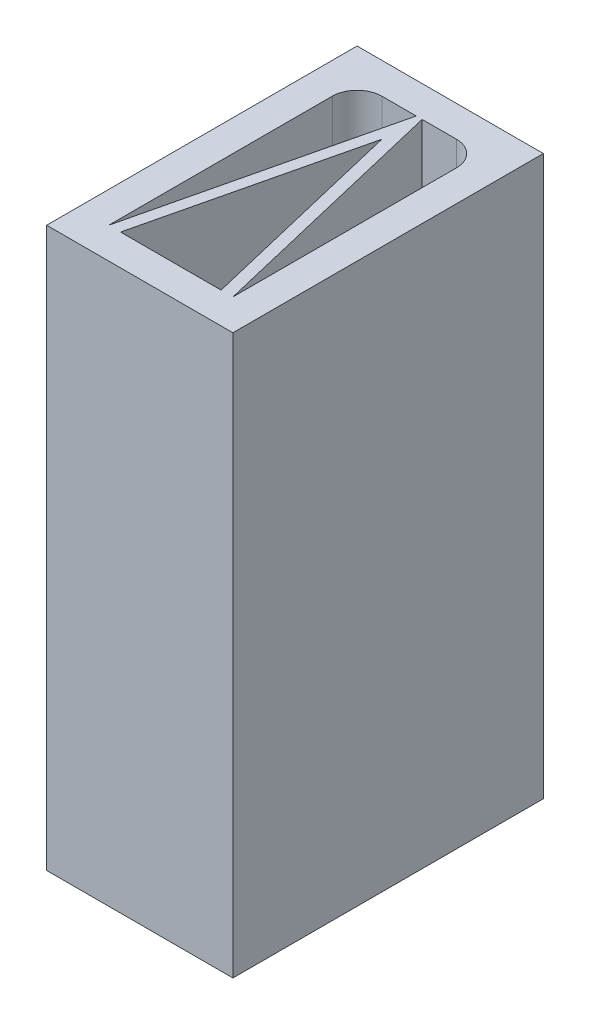
ISO-10303-21;
HEADER;
FILE_DESCRIPTION(('STEP AP214'),'2;1');
FILE_NAME('part.step','',(''),(''),'','','');
FILE_SCHEMA(('AUTOMOTIVE_DESIGN { 1 0 10303 214 1 1 1 1 }'));
ENDSEC;
DATA;
#1=APPLICATION_CONTEXT('core data for automotive mechanical design processes');
#2=APPLICATION_PROTOCOL_DEFINITION('international standard','automotive_design',2000,#1);
#3=PRODUCT_CONTEXT('',#1,'mechanical');
#4=PRODUCT('Part','Part','',(#3));
#5=PRODUCT_RELATED_PRODUCT_CATEGORY('part','',(#4));
#6=PRODUCT_DEFINITION_FORMATION('','',#4);
#7=PRODUCT_DEFINITION_CONTEXT('part definition',#1,'design');
#8=PRODUCT_DEFINITION('design','',#6,#7);
#9=PRODUCT_DEFINITION_SHAPE('','',#8);
#10=(LENGTH_UNIT() NAMED_UNIT(*) SI_UNIT(.MILLI.,.METRE.));
#11=(NAMED_UNIT(*) PLANE_ANGLE_UNIT() SI_UNIT($,.RADIAN.));
#12=(NAMED_UNIT(*) SI_UNIT($,.STERADIAN.) SOLID_ANGLE_UNIT());
#13=UNCERTAINTY_MEASURE_WITH_UNIT(LENGTH_MEASURE(1.E-05),#10,'distance_accuracy_value','');
#14=(GEOMETRIC_REPRESENTATION_CONTEXT(3) GLOBAL_UNCERTAINTY_ASSIGNED_CONTEXT((#13)) GLOBAL_UNIT_ASSIGNED_CONTEXT((#10,
#11,#12)) REPRESENTATION_CONTEXT('',''));
#15=CARTESIAN_POINT('',(0.,0.,0.));
#16=DIRECTION('',(0.,0.,1.));
#17=DIRECTION('',(1.,0.,0.));
#18=AXIS2_PLACEMENT_3D('',#15,#16,#17);
#19=CARTESIAN_POINT('',(2.5,45.,-22.5));
#20=DIRECTION('',(0.,0.,1.));
#21=DIRECTION('',(1.,0.,0.));
#22=AXIS2_PLACEMENT_3D('',#19,#20,#21);
#23=PLANE('',#22);
#24=DIRECTION('',(-1.,0.,0.));
#25=VECTOR('',#24,1.);
#26=CARTESIAN_POINT('',(2.5,0.,-22.5));
#27=LINE('',#26,#25);
#28=CARTESIAN_POINT('',(10.5,0.,-22.5));
#29=VERTEX_POINT('',#28);
#30=CARTESIAN_POINT('',(7.73809523809524,0.,-22.5));
#31=VERTEX_POINT('',#30);
#32=EDGE_CURVE('E186',#29,#31,#27,.T.);
#33=ORIENTED_EDGE('',*,*,#32,.F.);
#34=DIRECTION('',(0.,-1.,0.));
#35=VECTOR('',#34,1.);
#36=CARTESIAN_POINT('',(10.5,45.,-22.5));
#37=LINE('',#36,#35);
#38=CARTESIAN_POINT('',(10.5,45.,-22.5));
#39=VERTEX_POINT('',#38);
#40=EDGE_CURVE('E53',#29,#39,#37,.F.);
#41=ORIENTED_EDGE('',*,*,#40,.T.);
#42=DIRECTION('',(-1.,0.,0.));
#43=VECTOR('',#42,1.);
#44=CARTESIAN_POINT('',(2.5,45.,-22.5));
#45=LINE('',#44,#43);
#46=CARTESIAN_POINT('',(7.73809523809524,45.,-22.5));
#47=VERTEX_POINT('',#46);
#48=EDGE_CURVE('E192',#39,#47,#45,.T.);
#49=ORIENTED_EDGE('',*,*,#48,.T.);
#50=DIRECTION('',(0.,1.,0.));
#51=VECTOR('',#50,1.);
#52=CARTESIAN_POINT('',(7.73809523809524,45.,-22.5));
#53=LINE('',#52,#51);
#54=EDGE_CURVE('E241',#31,#47,#53,.T.);
#55=ORIENTED_EDGE('',*,*,#54,.F.);
#56=EDGE_LOOP('',(#33,#41,#49,#55));
#57=FACE_BOUND('',#56,.T.);
#58=ADVANCED_FACE('F38',(#57),#23,.T.);
#59=CARTESIAN_POINT('',(0.,45.,0.));
#60=DIRECTION('',(0.,-1.,0.));
#61=DIRECTION('',(0.,0.,-1.));
#62=AXIS2_PLACEMENT_3D('',#59,#60,#61);
#63=PLANE('',#62);
#64=DIRECTION('',(0.23162052730604,0.,0.972806214685367));
#65=VECTOR('',#64,1.);
#66=CARTESIAN_POINT('',(12.5,45.,-2.5));
#67=LINE('',#66,#65);
#68=CARTESIAN_POINT('',(12.5,45.,-2.5));
#69=VERTEX_POINT('',#68);
#70=EDGE_CURVE('E174',#47,#69,#67,.T.);
#71=ORIENTED_EDGE('',*,*,#70,.F.);
#72=ORIENTED_EDGE('',*,*,#48,.F.);
#73=CARTESIAN_POINT('',(10.5,45.,-20.5));
#74=DIRECTION('',(0.,-1.,0.));
#75=DIRECTION('',(0.,0.,-1.));
#76=AXIS2_PLACEMENT_3D('',#73,#74,#75);
#77=CIRCLE('',#76,2.);
#78=CARTESIAN_POINT('',(12.5,45.,-20.5));
#79=VERTEX_POINT('',#78);
#80=EDGE_CURVE('E11',#39,#79,#77,.T.);
#81=ORIENTED_EDGE('',*,*,#80,.T.);
#82=DIRECTION('',(0.,0.,-1.));
#83=VECTOR('',#82,1.);
#84=CARTESIAN_POINT('',(12.5,45.,-22.5));
#85=LINE('',#84,#83);
#86=EDGE_CURVE('E188',#69,#79,#85,.T.);
#87=ORIENTED_EDGE('',*,*,#86,.F.);
#88=EDGE_LOOP('',(#71,#72,#81,#87));
#89=FACE_BOUND('',#88,.T.);
#90=DIRECTION('',(-0.231620527306039,0.,-0.972806214685367));
#91=VECTOR('',#90,1.);
#92=CARTESIAN_POINT('',(11.547619047619,45.,-2.5));
#93=LINE('',#92,#91);
#94=CARTESIAN_POINT('',(11.547619047619,45.,-2.5));
#95=VERTEX_POINT('',#94);
#96=CARTESIAN_POINT('',(7.5,45.,-19.5));
#97=VERTEX_POINT('',#96);
#98=EDGE_CURVE('E161',#95,#97,#93,.T.);
#99=ORIENTED_EDGE('',*,*,#98,.F.);
#100=DIRECTION('',(1.,0.,0.));
#101=VECTOR('',#100,1.);
#102=CARTESIAN_POINT('',(2.5,45.,-2.5));
#103=LINE('',#102,#101);
#104=CARTESIAN_POINT('',(3.45238095238096,45.,-2.5));
#105=VERTEX_POINT('',#104);
#106=EDGE_CURVE('E162',#105,#95,#103,.T.);
#107=ORIENTED_EDGE('',*,*,#106,.F.);
#108=DIRECTION('',(-0.231620527306039,0.,0.972806214685367));
#109=VECTOR('',#108,1.);
#110=CARTESIAN_POINT('',(7.5,45.,-19.5));
#111=LINE('',#110,#109);
#112=EDGE_CURVE('E146',#97,#105,#111,.T.);
#113=ORIENTED_EDGE('',*,*,#112,.F.);
#114=EDGE_LOOP('',(#99,#107,#113));
#115=FACE_BOUND('',#114,.T.);
#116=DIRECTION('',(0.,0.,1.));
#117=VECTOR('',#116,1.);
#118=CARTESIAN_POINT('',(0.,45.,0.));
#119=LINE('',#118,#117);
#120=CARTESIAN_POINT('',(0.,45.,-25.));
#121=VERTEX_POINT('',#120);
#122=CARTESIAN_POINT('',(0.,45.,0.));
#123=VERTEX_POINT('',#122);
#124=EDGE_CURVE('E209',#121,#123,#119,.T.);
#125=ORIENTED_EDGE('',*,*,#124,.T.);
#126=DIRECTION('',(1.,0.,0.));
#127=VECTOR('',#126,1.);
#128=CARTESIAN_POINT('',(0.,45.,0.));
#129=LINE('',#128,#127);
#130=CARTESIAN_POINT('',(15.,45.,0.));
#131=VERTEX_POINT('',#130);
#132=EDGE_CURVE('E212',#123,#131,#129,.T.);
#133=ORIENTED_EDGE('',*,*,#132,.T.);
#134=DIRECTION('',(0.,0.,-1.));
#135=VECTOR('',#134,1.);
#136=CARTESIAN_POINT('',(15.,45.,0.));
#137=LINE('',#136,#135);
#138=CARTESIAN_POINT('',(15.,45.,-25.));
#139=VERTEX_POINT('',#138);
#140=EDGE_CURVE('E215',#131,#139,#137,.T.);
#141=ORIENTED_EDGE('',*,*,#140,.T.);
#142=DIRECTION('',(-1.,0.,0.));
#143=VECTOR('',#142,1.);
#144=CARTESIAN_POINT('',(0.,45.,-25.));
#145=LINE('',#144,#143);
#146=EDGE_CURVE('E217',#139,#121,#145,.T.);
#147=ORIENTED_EDGE('',*,*,#146,.T.);
#148=EDGE_LOOP('',(#125,#133,#141,#147));
#149=FACE_BOUND('',#148,.T.);
#150=CARTESIAN_POINT('',(7.26190476190476,45.,-22.5));
#151=VERTEX_POINT('',#150);
#152=CARTESIAN_POINT('',(4.5,45.,-22.5));
#153=VERTEX_POINT('',#152);
#154=EDGE_CURVE('E191',#151,#153,#45,.T.);
#155=ORIENTED_EDGE('',*,*,#154,.F.);
#156=DIRECTION('',(0.23162052730604,0.,-0.972806214685367));
#157=VECTOR('',#156,1.);
#158=CARTESIAN_POINT('',(7.5,45.,-23.5));
#159=LINE('',#158,#157);
#160=CARTESIAN_POINT('',(2.5,45.,-2.5));
#161=VERTEX_POINT('',#160);
#162=EDGE_CURVE('E163',#161,#151,#159,.T.);
#163=ORIENTED_EDGE('',*,*,#162,.F.);
#164=DIRECTION('',(0.,0.,1.));
#165=VECTOR('',#164,1.);
#166=CARTESIAN_POINT('',(2.5,45.,-22.5));
#167=LINE('',#166,#165);
#168=CARTESIAN_POINT('',(2.5,45.,-20.5));
#169=VERTEX_POINT('',#168);
#170=EDGE_CURVE('E184',#169,#161,#167,.T.);
#171=ORIENTED_EDGE('',*,*,#170,.F.);
#172=CARTESIAN_POINT('',(4.5,45.,-20.5));
#173=DIRECTION('',(0.,-1.,0.));
#174=DIRECTION('',(0.,0.,-1.));
#175=AXIS2_PLACEMENT_3D('',#172,#173,#174);
#176=CIRCLE('',#175,2.);
#177=EDGE_CURVE('E255',#169,#153,#176,.T.);
#178=ORIENTED_EDGE('',*,*,#177,.T.);
#179=EDGE_LOOP('',(#155,#163,#171,#178));
#180=FACE_BOUND('',#179,.T.);
#181=ADVANCED_FACE('F159',(#89,#115,#149,#180),#63,.F.);
#182=CARTESIAN_POINT('',(0.,0.,0.));
#183=DIRECTION('',(0.,-1.,0.));
#184=DIRECTION('',(0.,0.,-1.));
#185=AXIS2_PLACEMENT_3D('',#182,#183,#184);
#186=PLANE('',#185);
#187=DIRECTION('',(0.,0.,-1.));
#188=VECTOR('',#187,1.);
#189=CARTESIAN_POINT('',(12.5,0.,-22.5));
#190=LINE('',#189,#188);
#191=CARTESIAN_POINT('',(12.5,0.,-2.5));
#192=VERTEX_POINT('',#191);
#193=CARTESIAN_POINT('',(12.5,0.,-20.5));
#194=VERTEX_POINT('',#193);
#195=EDGE_CURVE('E199',#192,#194,#190,.T.);
#196=ORIENTED_EDGE('',*,*,#195,.T.);
#197=CARTESIAN_POINT('',(10.5,0.,-20.5));
#198=DIRECTION('',(0.,-1.,0.));
#199=DIRECTION('',(0.,0.,-1.));
#200=AXIS2_PLACEMENT_3D('',#197,#198,#199);
#201=CIRCLE('',#200,2.);
#202=EDGE_CURVE('E46',#194,#29,#201,.F.);
#203=ORIENTED_EDGE('',*,*,#202,.T.);
#204=ORIENTED_EDGE('',*,*,#32,.T.);
#205=DIRECTION('',(0.23162052730604,0.,0.972806214685367));
#206=VECTOR('',#205,1.);
#207=CARTESIAN_POINT('',(12.5,0.,-2.5));
#208=LINE('',#207,#206);
#209=EDGE_CURVE('E167',#31,#192,#208,.T.);
#210=ORIENTED_EDGE('',*,*,#209,.T.);
#211=EDGE_LOOP('',(#196,#203,#204,#210));
#212=FACE_BOUND('',#211,.T.);
#213=DIRECTION('',(1.,0.,0.));
#214=VECTOR('',#213,1.);
#215=CARTESIAN_POINT('',(2.5,0.,-2.5));
#216=LINE('',#215,#214);
#217=CARTESIAN_POINT('',(3.45238095238096,0.,-2.5));
#218=VERTEX_POINT('',#217);
#219=CARTESIAN_POINT('',(11.547619047619,0.,-2.5));
#220=VERTEX_POINT('',#219);
#221=EDGE_CURVE('E196',#218,#220,#216,.T.);
#222=ORIENTED_EDGE('',*,*,#221,.T.);
#223=DIRECTION('',(-0.231620527306039,0.,-0.972806214685367));
#224=VECTOR('',#223,1.);
#225=CARTESIAN_POINT('',(11.547619047619,0.,-2.5));
#226=LINE('',#225,#224);
#227=CARTESIAN_POINT('',(7.5,0.,-19.5));
#228=VERTEX_POINT('',#227);
#229=EDGE_CURVE('E177',#220,#228,#226,.T.);
#230=ORIENTED_EDGE('',*,*,#229,.T.);
#231=DIRECTION('',(-0.231620527306039,0.,0.972806214685367));
#232=VECTOR('',#231,1.);
#233=CARTESIAN_POINT('',(7.5,0.,-19.5));
#234=LINE('',#233,#232);
#235=EDGE_CURVE('E148',#228,#218,#234,.T.);
#236=ORIENTED_EDGE('',*,*,#235,.T.);
#237=EDGE_LOOP('',(#222,#230,#236));
#238=FACE_BOUND('',#237,.T.);
#239=DIRECTION('',(0.23162052730604,0.,-0.972806214685367));
#240=VECTOR('',#239,1.);
#241=CARTESIAN_POINT('',(7.5,0.,-23.5));
#242=LINE('',#241,#240);
#243=CARTESIAN_POINT('',(2.5,0.,-2.5));
#244=VERTEX_POINT('',#243);
#245=CARTESIAN_POINT('',(7.26190476190476,0.,-22.5));
#246=VERTEX_POINT('',#245);
#247=EDGE_CURVE('E170',#244,#246,#242,.T.);
#248=ORIENTED_EDGE('',*,*,#247,.T.);
#249=CARTESIAN_POINT('',(4.5,0.,-22.5));
#250=VERTEX_POINT('',#249);
#251=EDGE_CURVE('E201',#246,#250,#27,.T.);
#252=ORIENTED_EDGE('',*,*,#251,.T.);
#253=CARTESIAN_POINT('',(4.5,0.,-20.5));
#254=DIRECTION('',(0.,-1.,0.));
#255=DIRECTION('',(0.,0.,-1.));
#256=AXIS2_PLACEMENT_3D('',#253,#254,#255);
#257=CIRCLE('',#256,2.);
#258=CARTESIAN_POINT('',(2.5,0.,-20.5));
#259=VERTEX_POINT('',#258);
#260=EDGE_CURVE('E253',#250,#259,#257,.F.);
#261=ORIENTED_EDGE('',*,*,#260,.T.);
#262=DIRECTION('',(0.,0.,1.));
#263=VECTOR('',#262,1.);
#264=CARTESIAN_POINT('',(2.5,0.,-22.5));
#265=LINE('',#264,#263);
#266=EDGE_CURVE('E181',#259,#244,#265,.T.);
#267=ORIENTED_EDGE('',*,*,#266,.T.);
#268=EDGE_LOOP('',(#248,#252,#261,#267));
#269=FACE_BOUND('',#268,.T.);
#270=DIRECTION('',(0.,0.,1.));
#271=VECTOR('',#270,1.);
#272=CARTESIAN_POINT('',(0.,0.,0.));
#273=LINE('',#272,#271);
#274=CARTESIAN_POINT('',(0.,0.,-25.));
#275=VERTEX_POINT('',#274);
#276=CARTESIAN_POINT('',(0.,0.,0.));
#277=VERTEX_POINT('',#276);
#278=EDGE_CURVE('E208',#275,#277,#273,.T.);
#279=ORIENTED_EDGE('',*,*,#278,.F.);
#280=DIRECTION('',(-1.,0.,0.));
#281=VECTOR('',#280,1.);
#282=CARTESIAN_POINT('',(0.,0.,-25.));
#283=LINE('',#282,#281);
#284=CARTESIAN_POINT('',(15.,0.,-25.));
#285=VERTEX_POINT('',#284);
#286=EDGE_CURVE('E213',#285,#275,#283,.T.);
#287=ORIENTED_EDGE('',*,*,#286,.F.);
#288=DIRECTION('',(0.,0.,-1.));
#289=VECTOR('',#288,1.);
#290=CARTESIAN_POINT('',(15.,0.,0.));
#291=LINE('',#290,#289);
#292=CARTESIAN_POINT('',(15.,0.,0.));
#293=VERTEX_POINT('',#292);
#294=EDGE_CURVE('E224',#293,#285,#291,.T.);
#295=ORIENTED_EDGE('',*,*,#294,.F.);
#296=DIRECTION('',(1.,0.,0.));
#297=VECTOR('',#296,1.);
#298=CARTESIAN_POINT('',(0.,0.,0.));
#299=LINE('',#298,#297);
#300=EDGE_CURVE('E222',#277,#293,#299,.T.);
#301=ORIENTED_EDGE('',*,*,#300,.F.);
#302=EDGE_LOOP('',(#279,#287,#295,#301));
#303=FACE_BOUND('',#302,.T.);
#304=ADVANCED_FACE('F273',(#212,#238,#269,#303),#186,.T.);
#305=CARTESIAN_POINT('',(0.,45.,0.));
#306=DIRECTION('',(1.,0.,0.));
#307=DIRECTION('',(0.,0.,-1.));
#308=AXIS2_PLACEMENT_3D('',#305,#306,#307);
#309=PLANE('',#308);
#310=ORIENTED_EDGE('',*,*,#278,.T.);
#311=DIRECTION('',(0.,-1.,0.));
#312=VECTOR('',#311,1.);
#313=CARTESIAN_POINT('',(0.,45.,0.));
#314=LINE('',#313,#312);
#315=EDGE_CURVE('E235',#123,#277,#314,.T.);
#316=ORIENTED_EDGE('',*,*,#315,.F.);
#317=ORIENTED_EDGE('',*,*,#124,.F.);
#318=DIRECTION('',(0.,-1.,0.));
#319=VECTOR('',#318,1.);
#320=CARTESIAN_POINT('',(0.,45.,-25.));
#321=LINE('',#320,#319);
#322=EDGE_CURVE('E219',#121,#275,#321,.T.);
#323=ORIENTED_EDGE('',*,*,#322,.T.);
#324=EDGE_LOOP('',(#310,#316,#317,#323));
#325=FACE_BOUND('',#324,.T.);
#326=ADVANCED_FACE('F318',(#325),#309,.F.);
#327=CARTESIAN_POINT('',(0.,45.,0.));
#328=DIRECTION('',(0.,0.,-1.));
#329=DIRECTION('',(-1.,0.,0.));
#330=AXIS2_PLACEMENT_3D('',#327,#328,#329);
#331=PLANE('',#330);
#332=ORIENTED_EDGE('',*,*,#300,.T.);
#333=DIRECTION('',(0.,-1.,0.));
#334=VECTOR('',#333,1.);
#335=CARTESIAN_POINT('',(15.,45.,0.));
#336=LINE('',#335,#334);
#337=EDGE_CURVE('E232',#131,#293,#336,.T.);
#338=ORIENTED_EDGE('',*,*,#337,.F.);
#339=ORIENTED_EDGE('',*,*,#132,.F.);
#340=ORIENTED_EDGE('',*,*,#315,.T.);
#341=EDGE_LOOP('',(#332,#338,#339,#340));
#342=FACE_BOUND('',#341,.T.);
#343=ADVANCED_FACE('F325',(#342),#331,.F.);
#344=CARTESIAN_POINT('',(15.,45.,0.));
#345=DIRECTION('',(-1.,0.,0.));
#346=DIRECTION('',(0.,0.,1.));
#347=AXIS2_PLACEMENT_3D('',#344,#345,#346);
#348=PLANE('',#347);
#349=ORIENTED_EDGE('',*,*,#294,.T.);
#350=DIRECTION('',(0.,-1.,0.));
#351=VECTOR('',#350,1.);
#352=CARTESIAN_POINT('',(15.,45.,-25.));
#353=LINE('',#352,#351);
#354=EDGE_CURVE('E229',#139,#285,#353,.T.);
#355=ORIENTED_EDGE('',*,*,#354,.F.);
#356=ORIENTED_EDGE('',*,*,#140,.F.);
#357=ORIENTED_EDGE('',*,*,#337,.T.);
#358=EDGE_LOOP('',(#349,#355,#356,#357));
#359=FACE_BOUND('',#358,.T.);
#360=ADVANCED_FACE('F321',(#359),#348,.F.);
#361=CARTESIAN_POINT('',(0.,45.,-25.));
#362=DIRECTION('',(0.,0.,1.));
#363=DIRECTION('',(1.,0.,0.));
#364=AXIS2_PLACEMENT_3D('',#361,#362,#363);
#365=PLANE('',#364);
#366=ORIENTED_EDGE('',*,*,#286,.T.);
#367=ORIENTED_EDGE('',*,*,#322,.F.);
#368=ORIENTED_EDGE('',*,*,#146,.F.);
#369=ORIENTED_EDGE('',*,*,#354,.T.);
#370=EDGE_LOOP('',(#366,#367,#368,#369));
#371=FACE_BOUND('',#370,.T.);
#372=ADVANCED_FACE('F314',(#371),#365,.F.);
#373=CARTESIAN_POINT('',(2.5,45.,-22.5));
#374=DIRECTION('',(1.,0.,0.));
#375=DIRECTION('',(0.,0.,-1.));
#376=AXIS2_PLACEMENT_3D('',#373,#374,#375);
#377=PLANE('',#376);
#378=ORIENTED_EDGE('',*,*,#266,.F.);
#379=DIRECTION('',(0.,-1.,0.));
#380=VECTOR('',#379,1.);
#381=CARTESIAN_POINT('',(2.5,45.,-20.5));
#382=LINE('',#381,#380);
#383=EDGE_CURVE('E247',#259,#169,#382,.F.);
#384=ORIENTED_EDGE('',*,*,#383,.T.);
#385=ORIENTED_EDGE('',*,*,#170,.T.);
#386=DIRECTION('',(0.,-1.,0.));
#387=VECTOR('',#386,1.);
#388=CARTESIAN_POINT('',(2.5,45.,-2.5));
#389=LINE('',#388,#387);
#390=EDGE_CURVE('E205',#161,#244,#389,.T.);
#391=ORIENTED_EDGE('',*,*,#390,.T.);
#392=EDGE_LOOP('',(#378,#384,#385,#391));
#393=FACE_BOUND('',#392,.T.);
#394=ADVANCED_FACE('F277',(#393),#377,.T.);
#395=CARTESIAN_POINT('',(2.5,45.,-2.5));
#396=DIRECTION('',(0.,0.,-1.));
#397=DIRECTION('',(-1.,0.,0.));
#398=AXIS2_PLACEMENT_3D('',#395,#396,#397);
#399=PLANE('',#398);
#400=DIRECTION('',(0.,-1.,0.));
#401=VECTOR('',#400,1.);
#402=CARTESIAN_POINT('',(3.45238095238096,45.,-2.5));
#403=LINE('',#402,#401);
#404=EDGE_CURVE('E153',#105,#218,#403,.T.);
#405=ORIENTED_EDGE('',*,*,#404,.F.);
#406=ORIENTED_EDGE('',*,*,#106,.T.);
#407=DIRECTION('',(0.,-1.,0.));
#408=VECTOR('',#407,1.);
#409=CARTESIAN_POINT('',(11.547619047619,45.,-2.5));
#410=LINE('',#409,#408);
#411=EDGE_CURVE('E154',#95,#220,#410,.T.);
#412=ORIENTED_EDGE('',*,*,#411,.T.);
#413=ORIENTED_EDGE('',*,*,#221,.F.);
#414=EDGE_LOOP('',(#405,#406,#412,#413));
#415=FACE_BOUND('',#414,.T.);
#416=ADVANCED_FACE('F305',(#415),#399,.T.);
#417=CARTESIAN_POINT('',(12.5,45.,-22.5));
#418=DIRECTION('',(-1.,0.,0.));
#419=DIRECTION('',(0.,0.,1.));
#420=AXIS2_PLACEMENT_3D('',#417,#418,#419);
#421=PLANE('',#420);
#422=ORIENTED_EDGE('',*,*,#86,.T.);
#423=DIRECTION('',(0.,-1.,0.));
#424=VECTOR('',#423,1.);
#425=CARTESIAN_POINT('',(12.5,0.,-20.5));
#426=LINE('',#425,#424);
#427=EDGE_CURVE('E249',#79,#194,#426,.T.);
#428=ORIENTED_EDGE('',*,*,#427,.T.);
#429=ORIENTED_EDGE('',*,*,#195,.F.);
#430=DIRECTION('',(0.,-1.,0.));
#431=VECTOR('',#430,1.);
#432=CARTESIAN_POINT('',(12.5,45.,-2.5));
#433=LINE('',#432,#431);
#434=EDGE_CURVE('E194',#69,#192,#433,.T.);
#435=ORIENTED_EDGE('',*,*,#434,.F.);
#436=EDGE_LOOP('',(#422,#428,#429,#435));
#437=FACE_BOUND('',#436,.T.);
#438=ADVANCED_FACE('F301',(#437),#421,.T.);
#439=ORIENTED_EDGE('',*,*,#154,.T.);
#440=DIRECTION('',(0.,-1.,0.));
#441=VECTOR('',#440,1.);
#442=CARTESIAN_POINT('',(4.5,0.,-22.5));
#443=LINE('',#442,#441);
#444=EDGE_CURVE('E244',#153,#250,#443,.T.);
#445=ORIENTED_EDGE('',*,*,#444,.T.);
#446=ORIENTED_EDGE('',*,*,#251,.F.);
#447=DIRECTION('',(0.,-1.,0.));
#448=VECTOR('',#447,1.);
#449=CARTESIAN_POINT('',(7.26190476190476,45.,-22.5));
#450=LINE('',#449,#448);
#451=EDGE_CURVE('E238',#151,#246,#450,.T.);
#452=ORIENTED_EDGE('',*,*,#451,.F.);
#453=EDGE_LOOP('',(#439,#445,#446,#452));
#454=FACE_BOUND('',#453,.T.);
#455=ADVANCED_FACE('F267',(#454),#23,.T.);
#456=CARTESIAN_POINT('',(12.5,45.,-2.5));
#457=DIRECTION('',(0.972806214685367,0.,-0.231620527306039));
#458=DIRECTION('',(-0.23162052730604,0.,-0.972806214685367));
#459=AXIS2_PLACEMENT_3D('',#456,#457,#458);
#460=PLANE('',#459);
#461=ORIENTED_EDGE('',*,*,#209,.F.);
#462=ORIENTED_EDGE('',*,*,#54,.T.);
#463=ORIENTED_EDGE('',*,*,#70,.T.);
#464=ORIENTED_EDGE('',*,*,#434,.T.);
#465=EDGE_LOOP('',(#461,#462,#463,#464));
#466=FACE_BOUND('',#465,.T.);
#467=ADVANCED_FACE('F282',(#466),#460,.T.);
#468=CARTESIAN_POINT('',(7.5,45.,-23.5));
#469=DIRECTION('',(-0.972806214685367,0.,-0.231620527306039));
#470=DIRECTION('',(-0.23162052730604,0.,0.972806214685367));
#471=AXIS2_PLACEMENT_3D('',#468,#469,#470);
#472=PLANE('',#471);
#473=ORIENTED_EDGE('',*,*,#162,.T.);
#474=ORIENTED_EDGE('',*,*,#451,.T.);
#475=ORIENTED_EDGE('',*,*,#247,.F.);
#476=ORIENTED_EDGE('',*,*,#390,.F.);
#477=EDGE_LOOP('',(#473,#474,#475,#476));
#478=FACE_BOUND('',#477,.T.);
#479=ADVANCED_FACE('F280',(#478),#472,.T.);
#480=CARTESIAN_POINT('',(7.5,45.,-19.5));
#481=DIRECTION('',(0.972806214685367,0.,0.231620527306039));
#482=DIRECTION('',(0.231620527306039,0.,-0.972806214685367));
#483=AXIS2_PLACEMENT_3D('',#480,#481,#482);
#484=PLANE('',#483);
#485=ORIENTED_EDGE('',*,*,#235,.F.);
#486=DIRECTION('',(0.,-1.,0.));
#487=VECTOR('',#486,1.);
#488=CARTESIAN_POINT('',(7.5,45.,-19.5));
#489=LINE('',#488,#487);
#490=EDGE_CURVE('E142',#97,#228,#489,.T.);
#491=ORIENTED_EDGE('',*,*,#490,.F.);
#492=ORIENTED_EDGE('',*,*,#112,.T.);
#493=ORIENTED_EDGE('',*,*,#404,.T.);
#494=EDGE_LOOP('',(#485,#491,#492,#493));
#495=FACE_BOUND('',#494,.T.);
#496=ADVANCED_FACE('F144',(#495),#484,.T.);
#497=CARTESIAN_POINT('',(11.547619047619,45.,-2.5));
#498=DIRECTION('',(-0.972806214685367,0.,0.231620527306039));
#499=DIRECTION('',(0.231620527306039,0.,0.972806214685367));
#500=AXIS2_PLACEMENT_3D('',#497,#498,#499);
#501=PLANE('',#500);
#502=ORIENTED_EDGE('',*,*,#229,.F.);
#503=ORIENTED_EDGE('',*,*,#411,.F.);
#504=ORIENTED_EDGE('',*,*,#98,.T.);
#505=ORIENTED_EDGE('',*,*,#490,.T.);
#506=EDGE_LOOP('',(#502,#503,#504,#505));
#507=FACE_BOUND('',#506,.T.);
#508=ADVANCED_FACE('F166',(#507),#501,.T.);
#509=CARTESIAN_POINT('',(4.5,45.,-20.5));
#510=DIRECTION('',(0.,1.,0.));
#511=DIRECTION('',(0.,0.,1.));
#512=AXIS2_PLACEMENT_3D('',#509,#510,#511);
#513=CYLINDRICAL_SURFACE('',#512,2.);
#514=ORIENTED_EDGE('',*,*,#177,.F.);
#515=ORIENTED_EDGE('',*,*,#383,.F.);
#516=ORIENTED_EDGE('',*,*,#260,.F.);
#517=ORIENTED_EDGE('',*,*,#444,.F.);
#518=EDGE_LOOP('',(#514,#515,#516,#517));
#519=FACE_BOUND('',#518,.T.);
#520=ADVANCED_FACE('F270',(#519),#513,.F.);
#521=CARTESIAN_POINT('',(10.5,45.,-20.5));
#522=DIRECTION('',(0.,1.,0.));
#523=DIRECTION('',(0.,0.,1.));
#524=AXIS2_PLACEMENT_3D('',#521,#522,#523);
#525=CYLINDRICAL_SURFACE('',#524,2.);
#526=ORIENTED_EDGE('',*,*,#80,.F.);
#527=ORIENTED_EDGE('',*,*,#40,.F.);
#528=ORIENTED_EDGE('',*,*,#202,.F.);
#529=ORIENTED_EDGE('',*,*,#427,.F.);
#530=EDGE_LOOP('',(#526,#527,#528,#529));
#531=FACE_BOUND('',#530,.T.);
#532=ADVANCED_FACE('F40',(#531),#525,.F.);
#533=CLOSED_SHELL('',(#58,#181,#304,#326,#343,#360,#372,#394,#416,#438,#455,#467,#479,#496,#508,
#520,#532));
#534=MANIFOLD_SOLID_BREP('B2',#533);
#535=ADVANCED_BREP_SHAPE_REPRESENTATION('',(#18,#534),#14);
#536=SHAPE_DEFINITION_REPRESENTATION(#9,#535);
ENDSEC;
END-ISO-10303-21;
